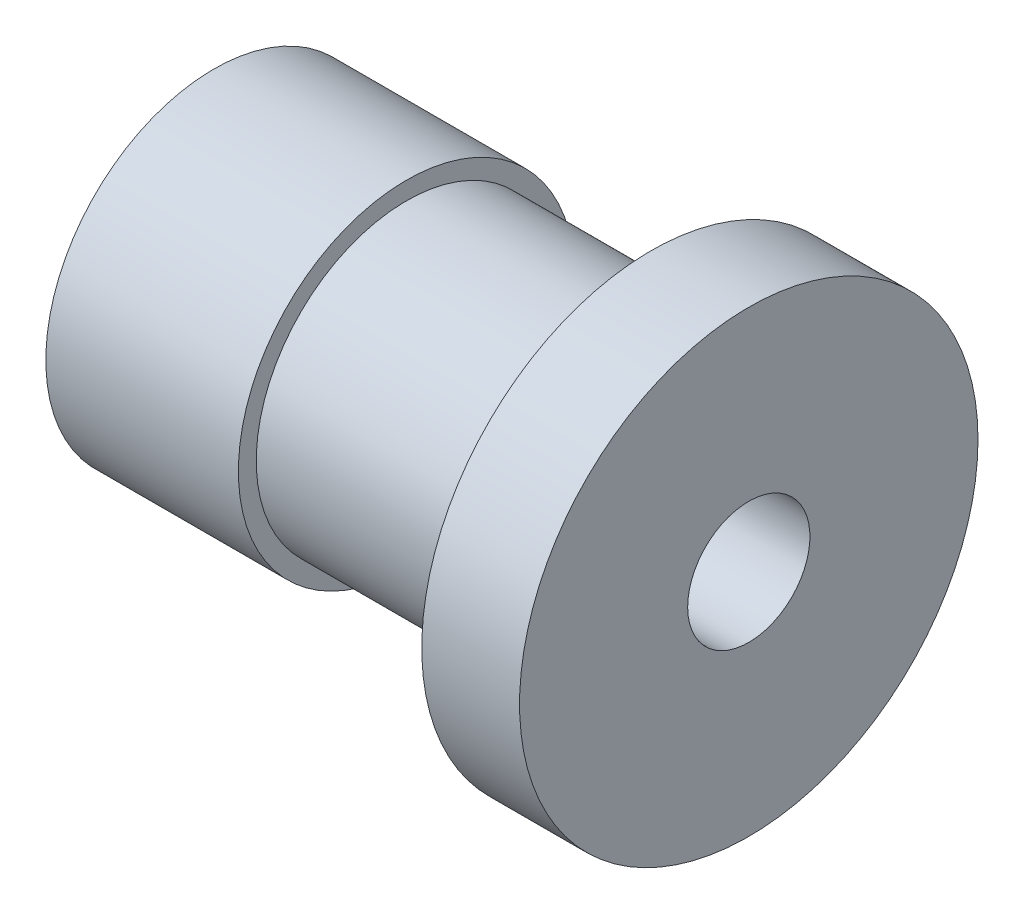
ISO-10303-21;
HEADER;
FILE_DESCRIPTION(('STEP AP214'),'2;1');
FILE_NAME('part.step','',(''),(''),'','','');
FILE_SCHEMA(('AUTOMOTIVE_DESIGN { 1 0 10303 214 1 1 1 1 }'));
ENDSEC;
DATA;
#1=APPLICATION_CONTEXT('core data for automotive mechanical design processes');
#2=APPLICATION_PROTOCOL_DEFINITION('international standard','automotive_design',2000,#1);
#3=PRODUCT_CONTEXT('',#1,'mechanical');
#4=PRODUCT('Part','Part','',(#3));
#5=PRODUCT_RELATED_PRODUCT_CATEGORY('part','',(#4));
#6=PRODUCT_DEFINITION_FORMATION('','',#4);
#7=PRODUCT_DEFINITION_CONTEXT('part definition',#1,'design');
#8=PRODUCT_DEFINITION('design','',#6,#7);
#9=PRODUCT_DEFINITION_SHAPE('','',#8);
#10=(LENGTH_UNIT() NAMED_UNIT(*) SI_UNIT(.MILLI.,.METRE.));
#11=(NAMED_UNIT(*) PLANE_ANGLE_UNIT() SI_UNIT($,.RADIAN.));
#12=(NAMED_UNIT(*) SI_UNIT($,.STERADIAN.) SOLID_ANGLE_UNIT());
#13=UNCERTAINTY_MEASURE_WITH_UNIT(LENGTH_MEASURE(1.E-05),#10,'distance_accuracy_value','');
#14=(GEOMETRIC_REPRESENTATION_CONTEXT(3) GLOBAL_UNCERTAINTY_ASSIGNED_CONTEXT((#13)) GLOBAL_UNIT_ASSIGNED_CONTEXT((#10,
#11,#12)) REPRESENTATION_CONTEXT('',''));
#15=CARTESIAN_POINT('',(0.,0.,0.));
#16=DIRECTION('',(0.,0.,1.));
#17=DIRECTION('',(1.,0.,0.));
#18=AXIS2_PLACEMENT_3D('',#15,#16,#17);
#19=CARTESIAN_POINT('',(6.3,0.,0.));
#20=DIRECTION('',(-1.,0.,0.));
#21=DIRECTION('',(0.,0.,1.));
#22=AXIS2_PLACEMENT_3D('',#19,#20,#21);
#23=CYLINDRICAL_SURFACE('',#22,5.5);
#24=CARTESIAN_POINT('',(6.3,0.,0.));
#25=DIRECTION('',(1.,0.,0.));
#26=DIRECTION('',(0.,0.,-1.));
#27=AXIS2_PLACEMENT_3D('',#24,#25,#26);
#28=CIRCLE('',#27,5.5);
#29=CARTESIAN_POINT('',(6.3,0.,-5.5));
#30=VERTEX_POINT('',#29);
#31=EDGE_CURVE('E37',#30,#30,#28,.T.);
#32=ORIENTED_EDGE('',*,*,#31,.F.);
#33=EDGE_LOOP('',(#32));
#34=FACE_BOUND('',#33,.T.);
#35=CARTESIAN_POINT('',(0.,0.,0.));
#36=DIRECTION('',(1.,0.,0.));
#37=DIRECTION('',(0.,0.,-1.));
#38=AXIS2_PLACEMENT_3D('',#35,#36,#37);
#39=CIRCLE('',#38,5.5);
#40=CARTESIAN_POINT('',(0.,0.,-5.5));
#41=VERTEX_POINT('',#40);
#42=EDGE_CURVE('E33',#41,#41,#39,.T.);
#43=ORIENTED_EDGE('',*,*,#42,.T.);
#44=EDGE_LOOP('',(#43));
#45=FACE_BOUND('',#44,.T.);
#46=ADVANCED_FACE('F30',(#34,#45),#23,.T.);
#47=CARTESIAN_POINT('',(6.3,0.,0.));
#48=DIRECTION('',(1.,0.,0.));
#49=DIRECTION('',(0.,0.,-1.));
#50=AXIS2_PLACEMENT_3D('',#47,#48,#49);
#51=PLANE('',#50);
#52=CARTESIAN_POINT('',(6.3,0.,0.));
#53=DIRECTION('',(1.,0.,0.));
#54=DIRECTION('',(0.,0.,-1.));
#55=AXIS2_PLACEMENT_3D('',#52,#53,#54);
#56=CIRCLE('',#55,4.915);
#57=CARTESIAN_POINT('',(6.3,0.,-4.915));
#58=VERTEX_POINT('',#57);
#59=EDGE_CURVE('E10',#58,#58,#56,.T.);
#60=ORIENTED_EDGE('',*,*,#59,.F.);
#61=EDGE_LOOP('',(#60));
#62=FACE_BOUND('',#61,.T.);
#63=ORIENTED_EDGE('',*,*,#31,.T.);
#64=EDGE_LOOP('',(#63));
#65=FACE_BOUND('',#64,.T.);
#66=ADVANCED_FACE('F73',(#62,#65),#51,.T.);
#67=CARTESIAN_POINT('',(0.,0.,0.));
#68=DIRECTION('',(1.,0.,0.));
#69=DIRECTION('',(0.,0.,-1.));
#70=AXIS2_PLACEMENT_3D('',#67,#68,#69);
#71=PLANE('',#70);
#72=CARTESIAN_POINT('',(0.,0.,0.));
#73=DIRECTION('',(-1.,0.,0.));
#74=DIRECTION('',(0.,0.,1.));
#75=AXIS2_PLACEMENT_3D('',#72,#73,#74);
#76=CIRCLE('',#75,2.);
#77=CARTESIAN_POINT('',(0.,0.,2.));
#78=VERTEX_POINT('',#77);
#79=EDGE_CURVE('E53',#78,#78,#76,.T.);
#80=ORIENTED_EDGE('',*,*,#79,.F.);
#81=EDGE_LOOP('',(#80));
#82=FACE_BOUND('',#81,.T.);
#83=ORIENTED_EDGE('',*,*,#42,.F.);
#84=EDGE_LOOP('',(#83));
#85=FACE_BOUND('',#84,.T.);
#86=ADVANCED_FACE('F69',(#82,#85),#71,.F.);
#87=CARTESIAN_POINT('',(14.3,0.,0.));
#88=DIRECTION('',(-1.,0.,0.));
#89=DIRECTION('',(0.,0.,1.));
#90=AXIS2_PLACEMENT_3D('',#87,#88,#89);
#91=CYLINDRICAL_SURFACE('',#90,4.915);
#92=CARTESIAN_POINT('',(14.3,0.,0.));
#93=DIRECTION('',(1.,0.,0.));
#94=DIRECTION('',(0.,0.,-1.));
#95=AXIS2_PLACEMENT_3D('',#92,#93,#94);
#96=CIRCLE('',#95,4.915);
#97=CARTESIAN_POINT('',(14.3,0.,-4.915));
#98=VERTEX_POINT('',#97);
#99=EDGE_CURVE('E43',#98,#98,#96,.T.);
#100=ORIENTED_EDGE('',*,*,#99,.F.);
#101=EDGE_LOOP('',(#100));
#102=FACE_BOUND('',#101,.T.);
#103=ORIENTED_EDGE('',*,*,#59,.T.);
#104=EDGE_LOOP('',(#103));
#105=FACE_BOUND('',#104,.T.);
#106=ADVANCED_FACE('F72',(#102,#105),#91,.T.);
#107=CARTESIAN_POINT('',(17.5,0.,0.));
#108=DIRECTION('',(-1.,0.,0.));
#109=DIRECTION('',(0.,0.,1.));
#110=AXIS2_PLACEMENT_3D('',#107,#108,#109);
#111=CYLINDRICAL_SURFACE('',#110,7.5);
#112=CARTESIAN_POINT('',(17.5,0.,0.));
#113=DIRECTION('',(1.,0.,0.));
#114=DIRECTION('',(0.,0.,-1.));
#115=AXIS2_PLACEMENT_3D('',#112,#113,#114);
#116=CIRCLE('',#115,7.5);
#117=CARTESIAN_POINT('',(17.5,0.,-7.5));
#118=VERTEX_POINT('',#117);
#119=EDGE_CURVE('E46',#118,#118,#116,.T.);
#120=ORIENTED_EDGE('',*,*,#119,.F.);
#121=EDGE_LOOP('',(#120));
#122=FACE_BOUND('',#121,.T.);
#123=CARTESIAN_POINT('',(14.3,0.,0.));
#124=DIRECTION('',(1.,0.,0.));
#125=DIRECTION('',(0.,0.,-1.));
#126=AXIS2_PLACEMENT_3D('',#123,#124,#125);
#127=CIRCLE('',#126,7.5);
#128=CARTESIAN_POINT('',(14.3,0.,-7.5));
#129=VERTEX_POINT('',#128);
#130=EDGE_CURVE('E47',#129,#129,#127,.T.);
#131=ORIENTED_EDGE('',*,*,#130,.T.);
#132=EDGE_LOOP('',(#131));
#133=FACE_BOUND('',#132,.T.);
#134=ADVANCED_FACE('F91',(#122,#133),#111,.T.);
#135=CARTESIAN_POINT('',(17.5,0.,0.));
#136=DIRECTION('',(1.,0.,0.));
#137=DIRECTION('',(0.,0.,-1.));
#138=AXIS2_PLACEMENT_3D('',#135,#136,#137);
#139=PLANE('',#138);
#140=CARTESIAN_POINT('',(17.5,0.,0.));
#141=DIRECTION('',(-1.,0.,0.));
#142=DIRECTION('',(0.,0.,1.));
#143=AXIS2_PLACEMENT_3D('',#140,#141,#142);
#144=CIRCLE('',#143,2.);
#145=CARTESIAN_POINT('',(17.5,0.,2.));
#146=VERTEX_POINT('',#145);
#147=EDGE_CURVE('E50',#146,#146,#144,.T.);
#148=ORIENTED_EDGE('',*,*,#147,.T.);
#149=EDGE_LOOP('',(#148));
#150=FACE_BOUND('',#149,.T.);
#151=ORIENTED_EDGE('',*,*,#119,.T.);
#152=EDGE_LOOP('',(#151));
#153=FACE_BOUND('',#152,.T.);
#154=ADVANCED_FACE('F59',(#150,#153),#139,.T.);
#155=CARTESIAN_POINT('',(14.3,0.,0.));
#156=DIRECTION('',(1.,0.,0.));
#157=DIRECTION('',(0.,0.,-1.));
#158=AXIS2_PLACEMENT_3D('',#155,#156,#157);
#159=PLANE('',#158);
#160=ORIENTED_EDGE('',*,*,#99,.T.);
#161=EDGE_LOOP('',(#160));
#162=FACE_BOUND('',#161,.T.);
#163=ORIENTED_EDGE('',*,*,#130,.F.);
#164=EDGE_LOOP('',(#163));
#165=FACE_BOUND('',#164,.T.);
#166=ADVANCED_FACE('F65',(#162,#165),#159,.F.);
#167=CARTESIAN_POINT('',(17.5,0.,0.));
#168=DIRECTION('',(-1.,0.,0.));
#169=DIRECTION('',(0.,0.,1.));
#170=AXIS2_PLACEMENT_3D('',#167,#168,#169);
#171=CYLINDRICAL_SURFACE('',#170,2.);
#172=ORIENTED_EDGE('',*,*,#147,.F.);
#173=EDGE_LOOP('',(#172));
#174=FACE_BOUND('',#173,.T.);
#175=ORIENTED_EDGE('',*,*,#79,.T.);
#176=EDGE_LOOP('',(#175));
#177=FACE_BOUND('',#176,.T.);
#178=ADVANCED_FACE('F62',(#174,#177),#171,.F.);
#179=CLOSED_SHELL('',(#46,#66,#86,#106,#134,#154,#166,#178));
#180=MANIFOLD_SOLID_BREP('B2',#179);
#181=ADVANCED_BREP_SHAPE_REPRESENTATION('',(#18,#180),#14);
#182=SHAPE_DEFINITION_REPRESENTATION(#9,#181);
ENDSEC;
END-ISO-10303-21;
